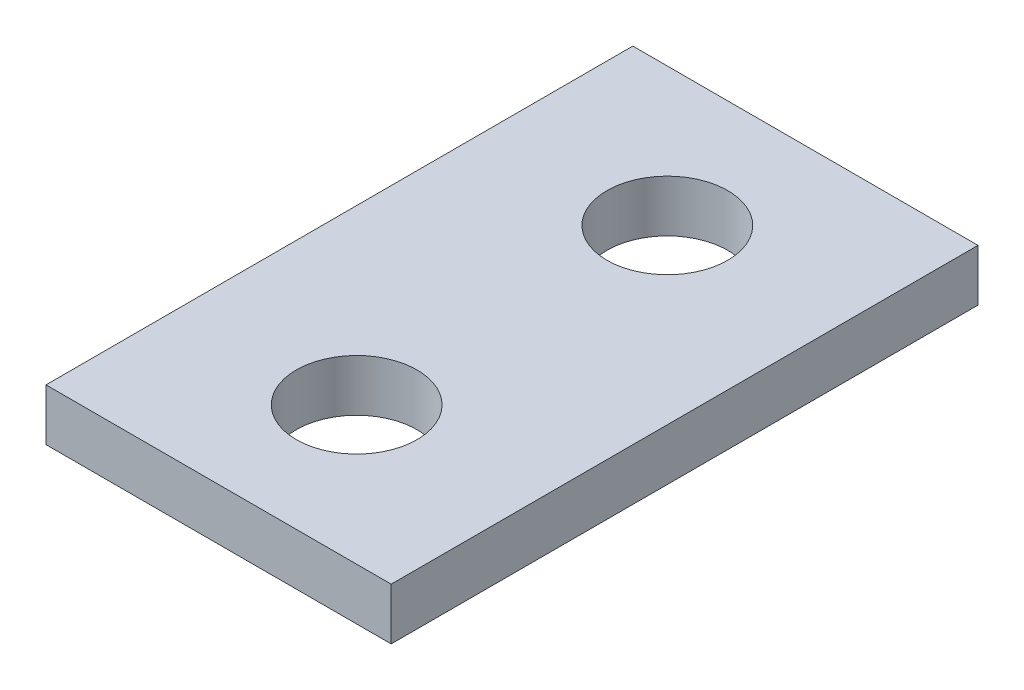
ISO-10303-21;
HEADER;
FILE_DESCRIPTION(('STEP AP214'),'2;1');
FILE_NAME('part.step','',(''),(''),'','','');
FILE_SCHEMA(('AUTOMOTIVE_DESIGN { 1 0 10303 214 1 1 1 1 }'));
ENDSEC;
DATA;
#1=APPLICATION_CONTEXT('core data for automotive mechanical design processes');
#2=APPLICATION_PROTOCOL_DEFINITION('international standard','automotive_design',2000,#1);
#3=PRODUCT_CONTEXT('',#1,'mechanical');
#4=PRODUCT('Part','Part','',(#3));
#5=PRODUCT_RELATED_PRODUCT_CATEGORY('part','',(#4));
#6=PRODUCT_DEFINITION_FORMATION('','',#4);
#7=PRODUCT_DEFINITION_CONTEXT('part definition',#1,'design');
#8=PRODUCT_DEFINITION('design','',#6,#7);
#9=PRODUCT_DEFINITION_SHAPE('','',#8);
#10=(LENGTH_UNIT() NAMED_UNIT(*) SI_UNIT(.MILLI.,.METRE.));
#11=(NAMED_UNIT(*) PLANE_ANGLE_UNIT() SI_UNIT($,.RADIAN.));
#12=(NAMED_UNIT(*) SI_UNIT($,.STERADIAN.) SOLID_ANGLE_UNIT());
#13=UNCERTAINTY_MEASURE_WITH_UNIT(LENGTH_MEASURE(1.E-05),#10,'distance_accuracy_value','');
#14=(GEOMETRIC_REPRESENTATION_CONTEXT(3) GLOBAL_UNCERTAINTY_ASSIGNED_CONTEXT((#13)) GLOBAL_UNIT_ASSIGNED_CONTEXT((#10,
#11,#12)) REPRESENTATION_CONTEXT('',''));
#15=CARTESIAN_POINT('',(0.,0.,0.));
#16=DIRECTION('',(0.,0.,1.));
#17=DIRECTION('',(1.,0.,0.));
#18=AXIS2_PLACEMENT_3D('',#15,#16,#17);
#19=CARTESIAN_POINT('',(0.,3.,0.));
#20=DIRECTION('',(0.,1.,0.));
#21=DIRECTION('',(0.,0.,1.));
#22=AXIS2_PLACEMENT_3D('',#19,#20,#21);
#23=PLANE('',#22);
#24=CARTESIAN_POINT('',(0.,3.,9.));
#25=DIRECTION('',(0.,1.,0.));
#26=DIRECTION('',(0.,0.,1.));
#27=AXIS2_PLACEMENT_3D('',#24,#25,#26);
#28=CIRCLE('',#27,3.5);
#29=CARTESIAN_POINT('',(0.,3.,12.5));
#30=VERTEX_POINT('',#29);
#31=EDGE_CURVE('E100',#30,#30,#28,.T.);
#32=ORIENTED_EDGE('',*,*,#31,.F.);
#33=EDGE_LOOP('',(#32));
#34=FACE_BOUND('',#33,.T.);
#35=DIRECTION('',(0.,0.,-1.));
#36=VECTOR('',#35,1.);
#37=CARTESIAN_POINT('',(9.99999999999999,3.,-17.));
#38=LINE('',#37,#36);
#39=CARTESIAN_POINT('',(10.,3.,17.));
#40=VERTEX_POINT('',#39);
#41=CARTESIAN_POINT('',(9.99999999999999,3.,-17.));
#42=VERTEX_POINT('',#41);
#43=EDGE_CURVE('E85',#40,#42,#38,.T.);
#44=ORIENTED_EDGE('',*,*,#43,.T.);
#45=DIRECTION('',(-1.,0.,0.));
#46=VECTOR('',#45,1.);
#47=CARTESIAN_POINT('',(-10.,3.,-17.));
#48=LINE('',#47,#46);
#49=CARTESIAN_POINT('',(-10.,3.,-17.));
#50=VERTEX_POINT('',#49);
#51=EDGE_CURVE('E80',#42,#50,#48,.T.);
#52=ORIENTED_EDGE('',*,*,#51,.T.);
#53=DIRECTION('',(0.,0.,1.));
#54=VECTOR('',#53,1.);
#55=CARTESIAN_POINT('',(-10.,3.,-17.));
#56=LINE('',#55,#54);
#57=CARTESIAN_POINT('',(-10.,3.,17.));
#58=VERTEX_POINT('',#57);
#59=EDGE_CURVE('E83',#50,#58,#56,.T.);
#60=ORIENTED_EDGE('',*,*,#59,.T.);
#61=DIRECTION('',(1.,0.,0.));
#62=VECTOR('',#61,1.);
#63=CARTESIAN_POINT('',(-10.,3.,17.));
#64=LINE('',#63,#62);
#65=EDGE_CURVE('E50',#58,#40,#64,.T.);
#66=ORIENTED_EDGE('',*,*,#65,.T.);
#67=EDGE_LOOP('',(#44,#52,#60,#66));
#68=FACE_BOUND('',#67,.T.);
#69=CARTESIAN_POINT('',(0.,3.,-9.));
#70=DIRECTION('',(0.,1.,0.));
#71=DIRECTION('',(0.,0.,1.));
#72=AXIS2_PLACEMENT_3D('',#69,#70,#71);
#73=CIRCLE('',#72,3.5);
#74=CARTESIAN_POINT('',(0.,3.,-5.5));
#75=VERTEX_POINT('',#74);
#76=EDGE_CURVE('E115',#75,#75,#73,.T.);
#77=ORIENTED_EDGE('',*,*,#76,.F.);
#78=EDGE_LOOP('',(#77));
#79=FACE_BOUND('',#78,.T.);
#80=ADVANCED_FACE('F33',(#34,#68,#79),#23,.T.);
#81=CARTESIAN_POINT('',(0.,0.,0.));
#82=DIRECTION('',(0.,1.,0.));
#83=DIRECTION('',(0.,0.,1.));
#84=AXIS2_PLACEMENT_3D('',#81,#82,#83);
#85=PLANE('',#84);
#86=DIRECTION('',(0.,0.,-1.));
#87=VECTOR('',#86,1.);
#88=CARTESIAN_POINT('',(9.99999999999999,0.,-17.));
#89=LINE('',#88,#87);
#90=CARTESIAN_POINT('',(10.,0.,17.));
#91=VERTEX_POINT('',#90);
#92=CARTESIAN_POINT('',(9.99999999999999,0.,-17.));
#93=VERTEX_POINT('',#92);
#94=EDGE_CURVE('E97',#91,#93,#89,.T.);
#95=ORIENTED_EDGE('',*,*,#94,.F.);
#96=DIRECTION('',(1.,0.,0.));
#97=VECTOR('',#96,1.);
#98=CARTESIAN_POINT('',(-10.,0.,17.));
#99=LINE('',#98,#97);
#100=CARTESIAN_POINT('',(-10.,0.,17.));
#101=VERTEX_POINT('',#100);
#102=EDGE_CURVE('E73',#101,#91,#99,.T.);
#103=ORIENTED_EDGE('',*,*,#102,.F.);
#104=DIRECTION('',(0.,0.,1.));
#105=VECTOR('',#104,1.);
#106=CARTESIAN_POINT('',(-10.,0.,-17.));
#107=LINE('',#106,#105);
#108=CARTESIAN_POINT('',(-10.,0.,-17.));
#109=VERTEX_POINT('',#108);
#110=EDGE_CURVE('E67',#109,#101,#107,.T.);
#111=ORIENTED_EDGE('',*,*,#110,.F.);
#112=DIRECTION('',(-1.,0.,0.));
#113=VECTOR('',#112,1.);
#114=CARTESIAN_POINT('',(-10.,0.,-17.));
#115=LINE('',#114,#113);
#116=EDGE_CURVE('E89',#93,#109,#115,.T.);
#117=ORIENTED_EDGE('',*,*,#116,.F.);
#118=EDGE_LOOP('',(#95,#103,#111,#117));
#119=FACE_BOUND('',#118,.T.);
#120=CARTESIAN_POINT('',(0.,0.,9.));
#121=DIRECTION('',(0.,1.,0.));
#122=DIRECTION('',(0.,0.,1.));
#123=AXIS2_PLACEMENT_3D('',#120,#121,#122);
#124=CIRCLE('',#123,3.5);
#125=CARTESIAN_POINT('',(0.,0.,12.5));
#126=VERTEX_POINT('',#125);
#127=EDGE_CURVE('E112',#126,#126,#124,.T.);
#128=ORIENTED_EDGE('',*,*,#127,.T.);
#129=EDGE_LOOP('',(#128));
#130=FACE_BOUND('',#129,.T.);
#131=CARTESIAN_POINT('',(0.,0.,-9.));
#132=DIRECTION('',(0.,1.,0.));
#133=DIRECTION('',(0.,0.,1.));
#134=AXIS2_PLACEMENT_3D('',#131,#132,#133);
#135=CIRCLE('',#134,3.5);
#136=CARTESIAN_POINT('',(0.,0.,-5.5));
#137=VERTEX_POINT('',#136);
#138=EDGE_CURVE('E118',#137,#137,#135,.T.);
#139=ORIENTED_EDGE('',*,*,#138,.T.);
#140=EDGE_LOOP('',(#139));
#141=FACE_BOUND('',#140,.T.);
#142=ADVANCED_FACE('F108',(#119,#130,#141),#85,.F.);
#143=CARTESIAN_POINT('',(9.99999999999999,3.,-17.));
#144=DIRECTION('',(-1.,0.,0.));
#145=DIRECTION('',(0.,0.,1.));
#146=AXIS2_PLACEMENT_3D('',#143,#144,#145);
#147=PLANE('',#146);
#148=ORIENTED_EDGE('',*,*,#94,.T.);
#149=DIRECTION('',(0.,-1.,0.));
#150=VECTOR('',#149,1.);
#151=CARTESIAN_POINT('',(9.99999999999999,3.,-17.));
#152=LINE('',#151,#150);
#153=EDGE_CURVE('E11',#42,#93,#152,.T.);
#154=ORIENTED_EDGE('',*,*,#153,.F.);
#155=ORIENTED_EDGE('',*,*,#43,.F.);
#156=DIRECTION('',(0.,-1.,0.));
#157=VECTOR('',#156,1.);
#158=CARTESIAN_POINT('',(10.,3.,17.));
#159=LINE('',#158,#157);
#160=EDGE_CURVE('E93',#40,#91,#159,.T.);
#161=ORIENTED_EDGE('',*,*,#160,.T.);
#162=EDGE_LOOP('',(#148,#154,#155,#161));
#163=FACE_BOUND('',#162,.T.);
#164=ADVANCED_FACE('F35',(#163),#147,.F.);
#165=CARTESIAN_POINT('',(-10.,3.,-17.));
#166=DIRECTION('',(0.,0.,1.));
#167=DIRECTION('',(1.,0.,0.));
#168=AXIS2_PLACEMENT_3D('',#165,#166,#167);
#169=PLANE('',#168);
#170=ORIENTED_EDGE('',*,*,#116,.T.);
#171=DIRECTION('',(0.,-1.,0.));
#172=VECTOR('',#171,1.);
#173=CARTESIAN_POINT('',(-10.,3.,-17.));
#174=LINE('',#173,#172);
#175=EDGE_CURVE('E42',#50,#109,#174,.T.);
#176=ORIENTED_EDGE('',*,*,#175,.F.);
#177=ORIENTED_EDGE('',*,*,#51,.F.);
#178=ORIENTED_EDGE('',*,*,#153,.T.);
#179=EDGE_LOOP('',(#170,#176,#177,#178));
#180=FACE_BOUND('',#179,.T.);
#181=ADVANCED_FACE('F88',(#180),#169,.F.);
#182=CARTESIAN_POINT('',(-10.,3.,-17.));
#183=DIRECTION('',(1.,0.,0.));
#184=DIRECTION('',(0.,0.,-1.));
#185=AXIS2_PLACEMENT_3D('',#182,#183,#184);
#186=PLANE('',#185);
#187=ORIENTED_EDGE('',*,*,#110,.T.);
#188=DIRECTION('',(0.,-1.,0.));
#189=VECTOR('',#188,1.);
#190=CARTESIAN_POINT('',(-10.,3.,17.));
#191=LINE('',#190,#189);
#192=EDGE_CURVE('E90',#58,#101,#191,.T.);
#193=ORIENTED_EDGE('',*,*,#192,.F.);
#194=ORIENTED_EDGE('',*,*,#59,.F.);
#195=ORIENTED_EDGE('',*,*,#175,.T.);
#196=EDGE_LOOP('',(#187,#193,#194,#195));
#197=FACE_BOUND('',#196,.T.);
#198=ADVANCED_FACE('F91',(#197),#186,.F.);
#199=CARTESIAN_POINT('',(-10.,3.,17.));
#200=DIRECTION('',(0.,0.,-1.));
#201=DIRECTION('',(-1.,0.,0.));
#202=AXIS2_PLACEMENT_3D('',#199,#200,#201);
#203=PLANE('',#202);
#204=ORIENTED_EDGE('',*,*,#102,.T.);
#205=ORIENTED_EDGE('',*,*,#160,.F.);
#206=ORIENTED_EDGE('',*,*,#65,.F.);
#207=ORIENTED_EDGE('',*,*,#192,.T.);
#208=EDGE_LOOP('',(#204,#205,#206,#207));
#209=FACE_BOUND('',#208,.T.);
#210=ADVANCED_FACE('F105',(#209),#203,.F.);
#211=CARTESIAN_POINT('',(0.,3.,9.));
#212=DIRECTION('',(0.,-1.,0.));
#213=DIRECTION('',(0.,0.,-1.));
#214=AXIS2_PLACEMENT_3D('',#211,#212,#213);
#215=CYLINDRICAL_SURFACE('',#214,3.5);
#216=ORIENTED_EDGE('',*,*,#31,.T.);
#217=EDGE_LOOP('',(#216));
#218=FACE_BOUND('',#217,.T.);
#219=ORIENTED_EDGE('',*,*,#127,.F.);
#220=EDGE_LOOP('',(#219));
#221=FACE_BOUND('',#220,.T.);
#222=ADVANCED_FACE('F135',(#218,#221),#215,.F.);
#223=CARTESIAN_POINT('',(0.,3.,-9.));
#224=DIRECTION('',(0.,-1.,0.));
#225=DIRECTION('',(0.,0.,-1.));
#226=AXIS2_PLACEMENT_3D('',#223,#224,#225);
#227=CYLINDRICAL_SURFACE('',#226,3.5);
#228=ORIENTED_EDGE('',*,*,#76,.T.);
#229=EDGE_LOOP('',(#228));
#230=FACE_BOUND('',#229,.T.);
#231=ORIENTED_EDGE('',*,*,#138,.F.);
#232=EDGE_LOOP('',(#231));
#233=FACE_BOUND('',#232,.T.);
#234=ADVANCED_FACE('F124',(#230,#233),#227,.F.);
#235=CLOSED_SHELL('',(#80,#142,#164,#181,#198,#210,#222,#234));
#236=MANIFOLD_SOLID_BREP('B2',#235);
#237=ADVANCED_BREP_SHAPE_REPRESENTATION('',(#18,#236),#14);
#238=SHAPE_DEFINITION_REPRESENTATION(#9,#237);
ENDSEC;
END-ISO-10303-21;
